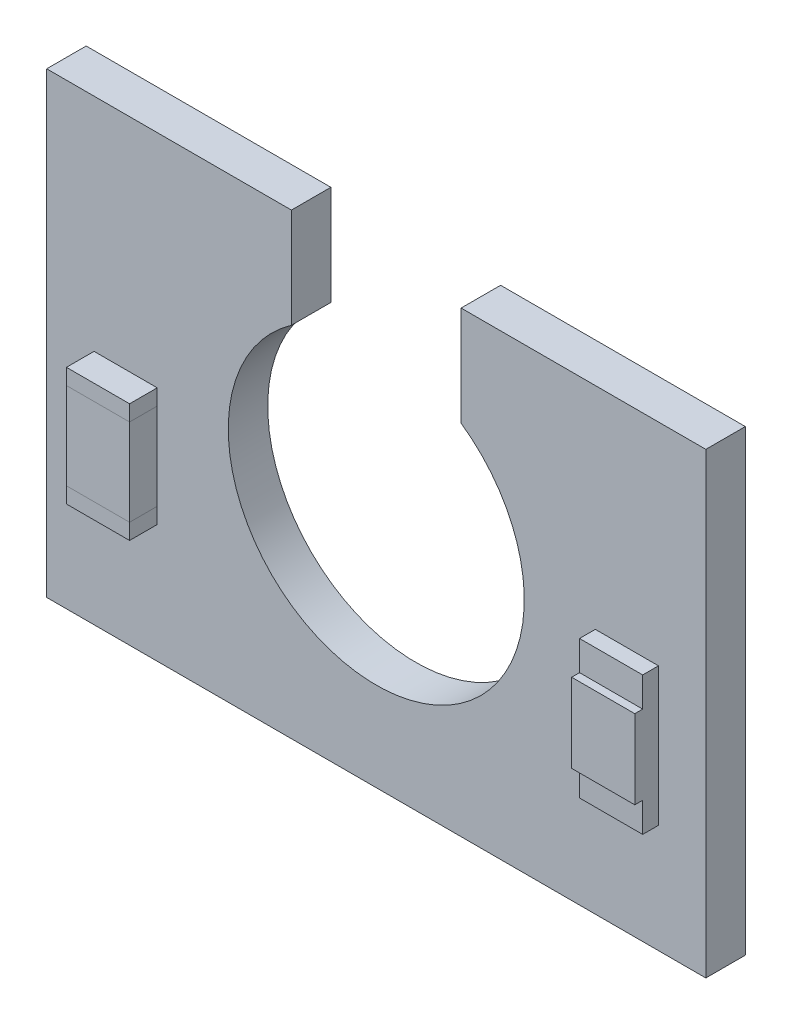
ISO-10303-21;
HEADER;
FILE_DESCRIPTION(('STEP AP214'),'2;1');
FILE_NAME('part.step','',(''),(''),'','','');
FILE_SCHEMA(('AUTOMOTIVE_DESIGN { 1 0 10303 214 1 1 1 1 }'));
ENDSEC;
DATA;
#1=APPLICATION_CONTEXT('core data for automotive mechanical design processes');
#2=APPLICATION_PROTOCOL_DEFINITION('international standard','automotive_design',2000,#1);
#3=PRODUCT_CONTEXT('',#1,'mechanical');
#4=PRODUCT('Part','Part','',(#3));
#5=PRODUCT_RELATED_PRODUCT_CATEGORY('part','',(#4));
#6=PRODUCT_DEFINITION_FORMATION('','',#4);
#7=PRODUCT_DEFINITION_CONTEXT('part definition',#1,'design');
#8=PRODUCT_DEFINITION('design','',#6,#7);
#9=PRODUCT_DEFINITION_SHAPE('','',#8);
#10=(LENGTH_UNIT() NAMED_UNIT(*) SI_UNIT(.MILLI.,.METRE.));
#11=(NAMED_UNIT(*) PLANE_ANGLE_UNIT() SI_UNIT($,.RADIAN.));
#12=(NAMED_UNIT(*) SI_UNIT($,.STERADIAN.) SOLID_ANGLE_UNIT());
#13=UNCERTAINTY_MEASURE_WITH_UNIT(LENGTH_MEASURE(1.E-05),#10,'distance_accuracy_value','');
#14=(GEOMETRIC_REPRESENTATION_CONTEXT(3) GLOBAL_UNCERTAINTY_ASSIGNED_CONTEXT((#13)) GLOBAL_UNIT_ASSIGNED_CONTEXT((#10,
#11,#12)) REPRESENTATION_CONTEXT('',''));
#15=CARTESIAN_POINT('',(0.,0.,0.));
#16=DIRECTION('',(0.,0.,1.));
#17=DIRECTION('',(1.,0.,0.));
#18=AXIS2_PLACEMENT_3D('',#15,#16,#17);
#19=CARTESIAN_POINT('',(0.,0.,0.4));
#20=DIRECTION('',(0.,0.,1.));
#21=DIRECTION('',(1.,0.,0.));
#22=AXIS2_PLACEMENT_3D('',#19,#20,#21);
#23=PLANE('',#22);
#24=DIRECTION('',(1.,0.,0.));
#25=VECTOR('',#24,1.);
#26=CARTESIAN_POINT('',(5.55,-2.3,0.4));
#27=LINE('',#26,#25);
#28=CARTESIAN_POINT('',(5.55,-2.3,0.4));
#29=VERTEX_POINT('',#28);
#30=CARTESIAN_POINT('',(7.15,-2.3,0.4));
#31=VERTEX_POINT('',#30);
#32=EDGE_CURVE('E58',#29,#31,#27,.T.);
#33=ORIENTED_EDGE('',*,*,#32,.F.);
#34=DIRECTION('',(0.,-1.,0.));
#35=VECTOR('',#34,1.);
#36=CARTESIAN_POINT('',(5.55,0.450000000000003,0.4));
#37=LINE('',#36,#35);
#38=CARTESIAN_POINT('',(5.55,-3.05,0.4));
#39=VERTEX_POINT('',#38);
#40=EDGE_CURVE('E143',#29,#39,#37,.T.);
#41=ORIENTED_EDGE('',*,*,#40,.T.);
#42=DIRECTION('',(1.,0.,0.));
#43=VECTOR('',#42,1.);
#44=CARTESIAN_POINT('',(5.55,-3.05,0.4));
#45=LINE('',#44,#43);
#46=CARTESIAN_POINT('',(7.15,-3.05,0.4));
#47=VERTEX_POINT('',#46);
#48=EDGE_CURVE('E146',#39,#47,#45,.T.);
#49=ORIENTED_EDGE('',*,*,#48,.T.);
#50=DIRECTION('',(0.,1.,0.));
#51=VECTOR('',#50,1.);
#52=CARTESIAN_POINT('',(7.15,0.450000000000003,0.4));
#53=LINE('',#52,#51);
#54=EDGE_CURVE('E139',#47,#31,#53,.T.);
#55=ORIENTED_EDGE('',*,*,#54,.T.);
#56=EDGE_LOOP('',(#33,#41,#49,#55));
#57=FACE_BOUND('',#56,.T.);
#58=ADVANCED_FACE('F43',(#57),#23,.T.);
#59=CARTESIAN_POINT('',(7.15,0.450000000000003,0.4));
#60=DIRECTION('',(-1.,0.,0.));
#61=DIRECTION('',(0.,0.,1.));
#62=AXIS2_PLACEMENT_3D('',#59,#60,#61);
#63=PLANE('',#62);
#64=DIRECTION('',(0.,1.,0.));
#65=VECTOR('',#64,1.);
#66=CARTESIAN_POINT('',(7.15,0.450000000000003,0.));
#67=LINE('',#66,#65);
#68=CARTESIAN_POINT('',(7.15,-3.05,0.));
#69=VERTEX_POINT('',#68);
#70=CARTESIAN_POINT('',(7.15,0.450000000000003,0.));
#71=VERTEX_POINT('',#70);
#72=EDGE_CURVE('E131',#69,#71,#67,.T.);
#73=ORIENTED_EDGE('',*,*,#72,.T.);
#74=DIRECTION('',(0.,0.,-1.));
#75=VECTOR('',#74,1.);
#76=CARTESIAN_POINT('',(7.15,0.450000000000003,0.4));
#77=LINE('',#76,#75);
#78=CARTESIAN_POINT('',(7.15,0.450000000000003,0.4));
#79=VERTEX_POINT('',#78);
#80=EDGE_CURVE('E12',#79,#71,#77,.T.);
#81=ORIENTED_EDGE('',*,*,#80,.F.);
#82=CARTESIAN_POINT('',(7.15,-0.299999999999997,0.4));
#83=VERTEX_POINT('',#82);
#84=EDGE_CURVE('E130',#83,#79,#53,.T.);
#85=ORIENTED_EDGE('',*,*,#84,.F.);
#86=DIRECTION('',(0.,0.,-1.));
#87=VECTOR('',#86,1.);
#88=CARTESIAN_POINT('',(7.15,-0.299999999999997,0.6));
#89=LINE('',#88,#87);
#90=CARTESIAN_POINT('',(7.15,-0.299999999999997,0.6));
#91=VERTEX_POINT('',#90);
#92=EDGE_CURVE('E112',#91,#83,#89,.T.);
#93=ORIENTED_EDGE('',*,*,#92,.F.);
#94=DIRECTION('',(0.,1.,0.));
#95=VECTOR('',#94,1.);
#96=CARTESIAN_POINT('',(7.15,-0.299999999999997,0.6));
#97=LINE('',#96,#95);
#98=CARTESIAN_POINT('',(7.15,-2.3,0.6));
#99=VERTEX_POINT('',#98);
#100=EDGE_CURVE('E118',#99,#91,#97,.T.);
#101=ORIENTED_EDGE('',*,*,#100,.F.);
#102=DIRECTION('',(0.,0.,-1.));
#103=VECTOR('',#102,1.);
#104=CARTESIAN_POINT('',(7.15,-2.3,0.6));
#105=LINE('',#104,#103);
#106=EDGE_CURVE('E176',#99,#31,#105,.T.);
#107=ORIENTED_EDGE('',*,*,#106,.T.);
#108=ORIENTED_EDGE('',*,*,#54,.F.);
#109=DIRECTION('',(0.,0.,-1.));
#110=VECTOR('',#109,1.);
#111=CARTESIAN_POINT('',(7.15,-3.05,0.4));
#112=LINE('',#111,#110);
#113=EDGE_CURVE('E147',#47,#69,#112,.T.);
#114=ORIENTED_EDGE('',*,*,#113,.T.);
#115=EDGE_LOOP('',(#73,#81,#85,#93,#101,#107,#108,#114));
#116=FACE_BOUND('',#115,.T.);
#117=ADVANCED_FACE('F45',(#116),#63,.F.);
#118=CARTESIAN_POINT('',(5.55,0.450000000000003,0.4));
#119=DIRECTION('',(0.,-1.,0.));
#120=DIRECTION('',(0.,0.,-1.));
#121=AXIS2_PLACEMENT_3D('',#118,#119,#120);
#122=PLANE('',#121);
#123=DIRECTION('',(-1.,0.,0.));
#124=VECTOR('',#123,1.);
#125=CARTESIAN_POINT('',(5.55,0.450000000000003,0.));
#126=LINE('',#125,#124);
#127=CARTESIAN_POINT('',(5.55,0.450000000000003,0.));
#128=VERTEX_POINT('',#127);
#129=EDGE_CURVE('E133',#71,#128,#126,.T.);
#130=ORIENTED_EDGE('',*,*,#129,.T.);
#131=DIRECTION('',(0.,0.,-1.));
#132=VECTOR('',#131,1.);
#133=CARTESIAN_POINT('',(5.55,0.450000000000003,0.4));
#134=LINE('',#133,#132);
#135=CARTESIAN_POINT('',(5.55,0.450000000000003,0.4));
#136=VERTEX_POINT('',#135);
#137=EDGE_CURVE('E51',#136,#128,#134,.T.);
#138=ORIENTED_EDGE('',*,*,#137,.F.);
#139=DIRECTION('',(-1.,0.,0.));
#140=VECTOR('',#139,1.);
#141=CARTESIAN_POINT('',(5.55,0.450000000000003,0.4));
#142=LINE('',#141,#140);
#143=EDGE_CURVE('E141',#79,#136,#142,.T.);
#144=ORIENTED_EDGE('',*,*,#143,.F.);
#145=ORIENTED_EDGE('',*,*,#80,.T.);
#146=EDGE_LOOP('',(#130,#138,#144,#145));
#147=FACE_BOUND('',#146,.T.);
#148=ADVANCED_FACE('F200',(#147),#122,.F.);
#149=CARTESIAN_POINT('',(5.55,0.450000000000003,0.4));
#150=DIRECTION('',(1.,0.,0.));
#151=DIRECTION('',(0.,0.,-1.));
#152=AXIS2_PLACEMENT_3D('',#149,#150,#151);
#153=PLANE('',#152);
#154=DIRECTION('',(0.,-1.,0.));
#155=VECTOR('',#154,1.);
#156=CARTESIAN_POINT('',(5.55,0.450000000000003,0.));
#157=LINE('',#156,#155);
#158=CARTESIAN_POINT('',(5.55,-3.05,0.));
#159=VERTEX_POINT('',#158);
#160=EDGE_CURVE('E150',#128,#159,#157,.T.);
#161=ORIENTED_EDGE('',*,*,#160,.T.);
#162=DIRECTION('',(0.,0.,-1.));
#163=VECTOR('',#162,1.);
#164=CARTESIAN_POINT('',(5.55,-3.05,0.4));
#165=LINE('',#164,#163);
#166=EDGE_CURVE('E156',#39,#159,#165,.T.);
#167=ORIENTED_EDGE('',*,*,#166,.F.);
#168=ORIENTED_EDGE('',*,*,#40,.F.);
#169=DIRECTION('',(0.,0.,-1.));
#170=VECTOR('',#169,1.);
#171=CARTESIAN_POINT('',(5.55,-2.3,0.6));
#172=LINE('',#171,#170);
#173=CARTESIAN_POINT('',(5.55,-2.3,0.6));
#174=VERTEX_POINT('',#173);
#175=EDGE_CURVE('E135',#174,#29,#172,.T.);
#176=ORIENTED_EDGE('',*,*,#175,.F.);
#177=DIRECTION('',(0.,-1.,0.));
#178=VECTOR('',#177,1.);
#179=CARTESIAN_POINT('',(5.55,-0.299999999999997,0.6));
#180=LINE('',#179,#178);
#181=CARTESIAN_POINT('',(5.55,-0.299999999999997,0.6));
#182=VERTEX_POINT('',#181);
#183=EDGE_CURVE('E117',#182,#174,#180,.T.);
#184=ORIENTED_EDGE('',*,*,#183,.F.);
#185=DIRECTION('',(0.,0.,-1.));
#186=VECTOR('',#185,1.);
#187=CARTESIAN_POINT('',(5.55,-0.299999999999997,0.6));
#188=LINE('',#187,#186);
#189=CARTESIAN_POINT('',(5.55,-0.299999999999997,0.4));
#190=VERTEX_POINT('',#189);
#191=EDGE_CURVE('E114',#182,#190,#188,.T.);
#192=ORIENTED_EDGE('',*,*,#191,.T.);
#193=EDGE_CURVE('E144',#136,#190,#37,.T.);
#194=ORIENTED_EDGE('',*,*,#193,.F.);
#195=ORIENTED_EDGE('',*,*,#137,.T.);
#196=EDGE_LOOP('',(#161,#167,#168,#176,#184,#192,#194,#195));
#197=FACE_BOUND('',#196,.T.);
#198=ADVANCED_FACE('F163',(#197),#153,.F.);
#199=CARTESIAN_POINT('',(5.55,-3.05,0.4));
#200=DIRECTION('',(0.,1.,0.));
#201=DIRECTION('',(0.,0.,1.));
#202=AXIS2_PLACEMENT_3D('',#199,#200,#201);
#203=PLANE('',#202);
#204=DIRECTION('',(1.,0.,0.));
#205=VECTOR('',#204,1.);
#206=CARTESIAN_POINT('',(5.55,-3.05,0.));
#207=LINE('',#206,#205);
#208=EDGE_CURVE('E152',#159,#69,#207,.T.);
#209=ORIENTED_EDGE('',*,*,#208,.T.);
#210=ORIENTED_EDGE('',*,*,#113,.F.);
#211=ORIENTED_EDGE('',*,*,#48,.F.);
#212=ORIENTED_EDGE('',*,*,#166,.T.);
#213=EDGE_LOOP('',(#209,#210,#211,#212));
#214=FACE_BOUND('',#213,.T.);
#215=ADVANCED_FACE('F173',(#214),#203,.F.);
#216=DIRECTION('',(-1.,0.,0.));
#217=VECTOR('',#216,1.);
#218=CARTESIAN_POINT('',(5.55,-0.299999999999997,0.4));
#219=LINE('',#218,#217);
#220=EDGE_CURVE('E66',#83,#190,#219,.T.);
#221=ORIENTED_EDGE('',*,*,#220,.F.);
#222=ORIENTED_EDGE('',*,*,#84,.T.);
#223=ORIENTED_EDGE('',*,*,#143,.T.);
#224=ORIENTED_EDGE('',*,*,#193,.T.);
#225=EDGE_LOOP('',(#221,#222,#223,#224));
#226=FACE_BOUND('',#225,.T.);
#227=ADVANCED_FACE('F196',(#226),#23,.T.);
#228=CARTESIAN_POINT('',(0.,0.,0.));
#229=DIRECTION('',(0.,0.,1.));
#230=DIRECTION('',(1.,0.,0.));
#231=AXIS2_PLACEMENT_3D('',#228,#229,#230);
#232=PLANE('',#231);
#233=ORIENTED_EDGE('',*,*,#72,.F.);
#234=ORIENTED_EDGE('',*,*,#208,.F.);
#235=ORIENTED_EDGE('',*,*,#160,.F.);
#236=ORIENTED_EDGE('',*,*,#129,.F.);
#237=EDGE_LOOP('',(#233,#234,#235,#236));
#238=FACE_BOUND('',#237,.T.);
#239=ADVANCED_FACE('F170',(#238),#232,.F.);
#240=CARTESIAN_POINT('',(5.55,-0.299999999999997,0.6));
#241=DIRECTION('',(0.,-1.,0.));
#242=DIRECTION('',(0.,0.,-1.));
#243=AXIS2_PLACEMENT_3D('',#240,#241,#242);
#244=PLANE('',#243);
#245=ORIENTED_EDGE('',*,*,#220,.T.);
#246=ORIENTED_EDGE('',*,*,#191,.F.);
#247=DIRECTION('',(-1.,0.,0.));
#248=VECTOR('',#247,1.);
#249=CARTESIAN_POINT('',(5.55,-0.299999999999997,0.6));
#250=LINE('',#249,#248);
#251=EDGE_CURVE('E108',#91,#182,#250,.T.);
#252=ORIENTED_EDGE('',*,*,#251,.F.);
#253=ORIENTED_EDGE('',*,*,#92,.T.);
#254=EDGE_LOOP('',(#245,#246,#252,#253));
#255=FACE_BOUND('',#254,.T.);
#256=ADVANCED_FACE('F110',(#255),#244,.F.);
#257=CARTESIAN_POINT('',(5.55,-2.3,0.6));
#258=DIRECTION('',(0.,1.,0.));
#259=DIRECTION('',(0.,0.,1.));
#260=AXIS2_PLACEMENT_3D('',#257,#258,#259);
#261=PLANE('',#260);
#262=ORIENTED_EDGE('',*,*,#32,.T.);
#263=ORIENTED_EDGE('',*,*,#106,.F.);
#264=DIRECTION('',(1.,0.,0.));
#265=VECTOR('',#264,1.);
#266=CARTESIAN_POINT('',(5.55,-2.3,0.6));
#267=LINE('',#266,#265);
#268=EDGE_CURVE('E123',#174,#99,#267,.T.);
#269=ORIENTED_EDGE('',*,*,#268,.F.);
#270=ORIENTED_EDGE('',*,*,#175,.T.);
#271=EDGE_LOOP('',(#262,#263,#269,#270));
#272=FACE_BOUND('',#271,.T.);
#273=ADVANCED_FACE('F179',(#272),#261,.F.);
#274=CARTESIAN_POINT('',(0.,0.,0.6));
#275=DIRECTION('',(0.,0.,1.));
#276=DIRECTION('',(1.,0.,0.));
#277=AXIS2_PLACEMENT_3D('',#274,#275,#276);
#278=PLANE('',#277);
#279=ORIENTED_EDGE('',*,*,#100,.T.);
#280=ORIENTED_EDGE('',*,*,#251,.T.);
#281=ORIENTED_EDGE('',*,*,#183,.T.);
#282=ORIENTED_EDGE('',*,*,#268,.T.);
#283=EDGE_LOOP('',(#279,#280,#281,#282));
#284=FACE_BOUND('',#283,.T.);
#285=ADVANCED_FACE('F121',(#284),#278,.T.);
#286=CLOSED_SHELL('',(#58,#117,#148,#198,#215,#227,#239,#256,#273,#285));
#287=MANIFOLD_SOLID_BREP('B2',#286);
#288=CARTESIAN_POINT('',(-5.55,0.200000000000001,0.7));
#289=DIRECTION('',(-1.,0.,0.));
#290=DIRECTION('',(0.,0.,1.));
#291=AXIS2_PLACEMENT_3D('',#288,#289,#290);
#292=PLANE('',#291);
#293=DIRECTION('',(0.,0.,-1.));
#294=VECTOR('',#293,1.);
#295=CARTESIAN_POINT('',(-5.55,-0.199999999999999,0.7));
#296=LINE('',#295,#294);
#297=CARTESIAN_POINT('',(-5.55,-0.199999999999999,0.7));
#298=VERTEX_POINT('',#297);
#299=CARTESIAN_POINT('',(-5.55,-0.199999999999999,0.));
#300=VERTEX_POINT('',#299);
#301=EDGE_CURVE('E346',#298,#300,#296,.T.);
#302=ORIENTED_EDGE('',*,*,#301,.T.);
#303=DIRECTION('',(0.,-1.,0.));
#304=VECTOR('',#303,1.);
#305=CARTESIAN_POINT('',(-5.55,0.200000000000001,0.));
#306=LINE('',#305,#304);
#307=CARTESIAN_POINT('',(-5.55,0.200000000000001,0.));
#308=VERTEX_POINT('',#307);
#309=EDGE_CURVE('E41',#308,#300,#306,.T.);
#310=ORIENTED_EDGE('',*,*,#309,.F.);
#311=DIRECTION('',(0.,0.,-1.));
#312=VECTOR('',#311,1.);
#313=CARTESIAN_POINT('',(-5.55,0.200000000000001,0.7));
#314=LINE('',#313,#312);
#315=CARTESIAN_POINT('',(-5.55,0.200000000000001,0.7));
#316=VERTEX_POINT('',#315);
#317=EDGE_CURVE('E334',#316,#308,#314,.T.);
#318=ORIENTED_EDGE('',*,*,#317,.F.);
#319=DIRECTION('',(0.,-1.,0.));
#320=VECTOR('',#319,1.);
#321=CARTESIAN_POINT('',(-5.55,0.200000000000001,0.7));
#322=LINE('',#321,#320);
#323=EDGE_CURVE('E342',#316,#298,#322,.T.);
#324=ORIENTED_EDGE('',*,*,#323,.T.);
#325=EDGE_LOOP('',(#302,#310,#318,#324));
#326=FACE_BOUND('',#325,.T.);
#327=ADVANCED_FACE('F283',(#326),#292,.F.);
#328=CARTESIAN_POINT('',(-5.55,0.200000000000001,0.));
#329=DIRECTION('',(0.,0.,1.));
#330=DIRECTION('',(1.,0.,0.));
#331=AXIS2_PLACEMENT_3D('',#328,#329,#330);
#332=PLANE('',#331);
#333=DIRECTION('',(-1.,0.,0.));
#334=VECTOR('',#333,1.);
#335=CARTESIAN_POINT('',(-5.55,-0.199999999999999,0.));
#336=LINE('',#335,#334);
#337=CARTESIAN_POINT('',(-7.15,-0.199999999999999,0.));
#338=VERTEX_POINT('',#337);
#339=EDGE_CURVE('E338',#300,#338,#336,.T.);
#340=ORIENTED_EDGE('',*,*,#339,.T.);
#341=DIRECTION('',(0.,-1.,0.));
#342=VECTOR('',#341,1.);
#343=CARTESIAN_POINT('',(-7.15,0.200000000000001,0.));
#344=LINE('',#343,#342);
#345=CARTESIAN_POINT('',(-7.15,0.200000000000001,0.));
#346=VERTEX_POINT('',#345);
#347=EDGE_CURVE('E291',#346,#338,#344,.T.);
#348=ORIENTED_EDGE('',*,*,#347,.F.);
#349=DIRECTION('',(-1.,0.,0.));
#350=VECTOR('',#349,1.);
#351=CARTESIAN_POINT('',(-5.55,0.200000000000001,0.));
#352=LINE('',#351,#350);
#353=EDGE_CURVE('E329',#308,#346,#352,.T.);
#354=ORIENTED_EDGE('',*,*,#353,.F.);
#355=ORIENTED_EDGE('',*,*,#309,.T.);
#356=EDGE_LOOP('',(#340,#348,#354,#355));
#357=FACE_BOUND('',#356,.T.);
#358=ADVANCED_FACE('F337',(#357),#332,.F.);
#359=CARTESIAN_POINT('',(-7.15,0.200000000000001,0.));
#360=DIRECTION('',(1.,0.,0.));
#361=DIRECTION('',(0.,0.,-1.));
#362=AXIS2_PLACEMENT_3D('',#359,#360,#361);
#363=PLANE('',#362);
#364=DIRECTION('',(0.,0.,1.));
#365=VECTOR('',#364,1.);
#366=CARTESIAN_POINT('',(-7.15,-0.199999999999999,0.));
#367=LINE('',#366,#365);
#368=CARTESIAN_POINT('',(-7.15,-0.199999999999999,0.7));
#369=VERTEX_POINT('',#368);
#370=EDGE_CURVE('E316',#338,#369,#367,.T.);
#371=ORIENTED_EDGE('',*,*,#370,.T.);
#372=DIRECTION('',(0.,-1.,0.));
#373=VECTOR('',#372,1.);
#374=CARTESIAN_POINT('',(-7.15,0.200000000000001,0.7));
#375=LINE('',#374,#373);
#376=CARTESIAN_POINT('',(-7.15,0.200000000000001,0.7));
#377=VERTEX_POINT('',#376);
#378=EDGE_CURVE('E339',#377,#369,#375,.T.);
#379=ORIENTED_EDGE('',*,*,#378,.F.);
#380=DIRECTION('',(0.,0.,1.));
#381=VECTOR('',#380,1.);
#382=CARTESIAN_POINT('',(-7.15,0.200000000000001,0.));
#383=LINE('',#382,#381);
#384=EDGE_CURVE('E332',#346,#377,#383,.T.);
#385=ORIENTED_EDGE('',*,*,#384,.F.);
#386=ORIENTED_EDGE('',*,*,#347,.T.);
#387=EDGE_LOOP('',(#371,#379,#385,#386));
#388=FACE_BOUND('',#387,.T.);
#389=ADVANCED_FACE('F340',(#388),#363,.F.);
#390=CARTESIAN_POINT('',(-7.15,0.200000000000001,0.7));
#391=DIRECTION('',(0.,0.,-1.));
#392=DIRECTION('',(-1.,0.,0.));
#393=AXIS2_PLACEMENT_3D('',#390,#391,#392);
#394=PLANE('',#393);
#395=DIRECTION('',(1.,0.,0.));
#396=VECTOR('',#395,1.);
#397=CARTESIAN_POINT('',(-7.15,-0.199999999999999,0.7));
#398=LINE('',#397,#396);
#399=EDGE_CURVE('E322',#369,#298,#398,.T.);
#400=ORIENTED_EDGE('',*,*,#399,.T.);
#401=ORIENTED_EDGE('',*,*,#323,.F.);
#402=DIRECTION('',(1.,0.,0.));
#403=VECTOR('',#402,1.);
#404=CARTESIAN_POINT('',(-7.15,0.200000000000001,0.7));
#405=LINE('',#404,#403);
#406=EDGE_CURVE('E299',#377,#316,#405,.T.);
#407=ORIENTED_EDGE('',*,*,#406,.F.);
#408=ORIENTED_EDGE('',*,*,#378,.T.);
#409=EDGE_LOOP('',(#400,#401,#407,#408));
#410=FACE_BOUND('',#409,.T.);
#411=ADVANCED_FACE('F353',(#410),#394,.F.);
#412=CARTESIAN_POINT('',(0.,0.200000000000001,0.));
#413=DIRECTION('',(0.,1.,0.));
#414=DIRECTION('',(0.,0.,1.));
#415=AXIS2_PLACEMENT_3D('',#412,#413,#414);
#416=PLANE('',#415);
#417=ORIENTED_EDGE('',*,*,#317,.T.);
#418=ORIENTED_EDGE('',*,*,#353,.T.);
#419=ORIENTED_EDGE('',*,*,#384,.T.);
#420=ORIENTED_EDGE('',*,*,#406,.T.);
#421=EDGE_LOOP('',(#417,#418,#419,#420));
#422=FACE_BOUND('',#421,.T.);
#423=ADVANCED_FACE('F330',(#422),#416,.T.);
#424=CARTESIAN_POINT('',(0.,-0.199999999999999,0.));
#425=DIRECTION('',(0.,1.,0.));
#426=DIRECTION('',(0.,0.,1.));
#427=AXIS2_PLACEMENT_3D('',#424,#425,#426);
#428=PLANE('',#427);
#429=ORIENTED_EDGE('',*,*,#301,.F.);
#430=ORIENTED_EDGE('',*,*,#399,.F.);
#431=ORIENTED_EDGE('',*,*,#370,.F.);
#432=ORIENTED_EDGE('',*,*,#339,.F.);
#433=EDGE_LOOP('',(#429,#430,#431,#432));
#434=FACE_BOUND('',#433,.T.);
#435=ADVANCED_FACE('F356',(#434),#428,.F.);
#436=CLOSED_SHELL('',(#327,#358,#389,#411,#423,#435));
#437=MANIFOLD_SOLID_BREP('B6',#436);
#438=CARTESIAN_POINT('',(-7.15,-2.8,0.7));
#439=DIRECTION('',(1.,0.,0.));
#440=DIRECTION('',(0.,0.,-1.));
#441=AXIS2_PLACEMENT_3D('',#438,#439,#440);
#442=PLANE('',#441);
#443=DIRECTION('',(0.,0.,-1.));
#444=VECTOR('',#443,1.);
#445=CARTESIAN_POINT('',(-7.15,-2.4,0.7));
#446=LINE('',#445,#444);
#447=CARTESIAN_POINT('',(-7.15,-2.4,0.7));
#448=VERTEX_POINT('',#447);
#449=CARTESIAN_POINT('',(-7.15,-2.4,0.));
#450=VERTEX_POINT('',#449);
#451=EDGE_CURVE('E479',#448,#450,#446,.T.);
#452=ORIENTED_EDGE('',*,*,#451,.T.);
#453=DIRECTION('',(0.,1.,0.));
#454=VECTOR('',#453,1.);
#455=CARTESIAN_POINT('',(-7.15,-2.8,0.));
#456=LINE('',#455,#454);
#457=CARTESIAN_POINT('',(-7.15,-2.8,0.));
#458=VERTEX_POINT('',#457);
#459=EDGE_CURVE('E281',#458,#450,#456,.T.);
#460=ORIENTED_EDGE('',*,*,#459,.F.);
#461=DIRECTION('',(0.,0.,-1.));
#462=VECTOR('',#461,1.);
#463=CARTESIAN_POINT('',(-7.15,-2.8,0.7));
#464=LINE('',#463,#462);
#465=CARTESIAN_POINT('',(-7.15,-2.8,0.7));
#466=VERTEX_POINT('',#465);
#467=EDGE_CURVE('E467',#466,#458,#464,.T.);
#468=ORIENTED_EDGE('',*,*,#467,.F.);
#469=DIRECTION('',(0.,1.,0.));
#470=VECTOR('',#469,1.);
#471=CARTESIAN_POINT('',(-7.15,-2.8,0.7));
#472=LINE('',#471,#470);
#473=EDGE_CURVE('E475',#466,#448,#472,.T.);
#474=ORIENTED_EDGE('',*,*,#473,.T.);
#475=EDGE_LOOP('',(#452,#460,#468,#474));
#476=FACE_BOUND('',#475,.T.);
#477=ADVANCED_FACE('F416',(#476),#442,.F.);
#478=CARTESIAN_POINT('',(-7.15,-2.8,0.));
#479=DIRECTION('',(0.,0.,1.));
#480=DIRECTION('',(1.,0.,0.));
#481=AXIS2_PLACEMENT_3D('',#478,#479,#480);
#482=PLANE('',#481);
#483=DIRECTION('',(1.,0.,0.));
#484=VECTOR('',#483,1.);
#485=CARTESIAN_POINT('',(-7.15,-2.4,0.));
#486=LINE('',#485,#484);
#487=CARTESIAN_POINT('',(-5.55,-2.4,0.));
#488=VERTEX_POINT('',#487);
#489=EDGE_CURVE('E471',#450,#488,#486,.T.);
#490=ORIENTED_EDGE('',*,*,#489,.T.);
#491=DIRECTION('',(0.,1.,0.));
#492=VECTOR('',#491,1.);
#493=CARTESIAN_POINT('',(-5.55,-2.8,0.));
#494=LINE('',#493,#492);
#495=CARTESIAN_POINT('',(-5.55,-2.8,0.));
#496=VERTEX_POINT('',#495);
#497=EDGE_CURVE('E424',#496,#488,#494,.T.);
#498=ORIENTED_EDGE('',*,*,#497,.F.);
#499=DIRECTION('',(1.,0.,0.));
#500=VECTOR('',#499,1.);
#501=CARTESIAN_POINT('',(-7.15,-2.8,0.));
#502=LINE('',#501,#500);
#503=EDGE_CURVE('E462',#458,#496,#502,.T.);
#504=ORIENTED_EDGE('',*,*,#503,.F.);
#505=ORIENTED_EDGE('',*,*,#459,.T.);
#506=EDGE_LOOP('',(#490,#498,#504,#505));
#507=FACE_BOUND('',#506,.T.);
#508=ADVANCED_FACE('F470',(#507),#482,.F.);
#509=CARTESIAN_POINT('',(-5.55,-2.8,0.));
#510=DIRECTION('',(-1.,0.,0.));
#511=DIRECTION('',(0.,0.,1.));
#512=AXIS2_PLACEMENT_3D('',#509,#510,#511);
#513=PLANE('',#512);
#514=DIRECTION('',(0.,0.,1.));
#515=VECTOR('',#514,1.);
#516=CARTESIAN_POINT('',(-5.55,-2.4,0.));
#517=LINE('',#516,#515);
#518=CARTESIAN_POINT('',(-5.55,-2.4,0.7));
#519=VERTEX_POINT('',#518);
#520=EDGE_CURVE('E449',#488,#519,#517,.T.);
#521=ORIENTED_EDGE('',*,*,#520,.T.);
#522=DIRECTION('',(0.,1.,0.));
#523=VECTOR('',#522,1.);
#524=CARTESIAN_POINT('',(-5.55,-2.8,0.7));
#525=LINE('',#524,#523);
#526=CARTESIAN_POINT('',(-5.55,-2.8,0.7));
#527=VERTEX_POINT('',#526);
#528=EDGE_CURVE('E472',#527,#519,#525,.T.);
#529=ORIENTED_EDGE('',*,*,#528,.F.);
#530=DIRECTION('',(0.,0.,1.));
#531=VECTOR('',#530,1.);
#532=CARTESIAN_POINT('',(-5.55,-2.8,0.));
#533=LINE('',#532,#531);
#534=EDGE_CURVE('E465',#496,#527,#533,.T.);
#535=ORIENTED_EDGE('',*,*,#534,.F.);
#536=ORIENTED_EDGE('',*,*,#497,.T.);
#537=EDGE_LOOP('',(#521,#529,#535,#536));
#538=FACE_BOUND('',#537,.T.);
#539=ADVANCED_FACE('F473',(#538),#513,.F.);
#540=CARTESIAN_POINT('',(-5.55,-2.8,0.7));
#541=DIRECTION('',(0.,0.,-1.));
#542=DIRECTION('',(-1.,0.,0.));
#543=AXIS2_PLACEMENT_3D('',#540,#541,#542);
#544=PLANE('',#543);
#545=DIRECTION('',(-1.,0.,0.));
#546=VECTOR('',#545,1.);
#547=CARTESIAN_POINT('',(-5.55,-2.4,0.7));
#548=LINE('',#547,#546);
#549=EDGE_CURVE('E455',#519,#448,#548,.T.);
#550=ORIENTED_EDGE('',*,*,#549,.T.);
#551=ORIENTED_EDGE('',*,*,#473,.F.);
#552=DIRECTION('',(-1.,0.,0.));
#553=VECTOR('',#552,1.);
#554=CARTESIAN_POINT('',(-5.55,-2.8,0.7));
#555=LINE('',#554,#553);
#556=EDGE_CURVE('E432',#527,#466,#555,.T.);
#557=ORIENTED_EDGE('',*,*,#556,.F.);
#558=ORIENTED_EDGE('',*,*,#528,.T.);
#559=EDGE_LOOP('',(#550,#551,#557,#558));
#560=FACE_BOUND('',#559,.T.);
#561=ADVANCED_FACE('F486',(#560),#544,.F.);
#562=CARTESIAN_POINT('',(0.,-2.8,0.));
#563=DIRECTION('',(0.,-1.,0.));
#564=DIRECTION('',(0.,0.,-1.));
#565=AXIS2_PLACEMENT_3D('',#562,#563,#564);
#566=PLANE('',#565);
#567=ORIENTED_EDGE('',*,*,#467,.T.);
#568=ORIENTED_EDGE('',*,*,#503,.T.);
#569=ORIENTED_EDGE('',*,*,#534,.T.);
#570=ORIENTED_EDGE('',*,*,#556,.T.);
#571=EDGE_LOOP('',(#567,#568,#569,#570));
#572=FACE_BOUND('',#571,.T.);
#573=ADVANCED_FACE('F463',(#572),#566,.T.);
#574=CARTESIAN_POINT('',(0.,-2.4,0.));
#575=DIRECTION('',(0.,-1.,0.));
#576=DIRECTION('',(0.,0.,-1.));
#577=AXIS2_PLACEMENT_3D('',#574,#575,#576);
#578=PLANE('',#577);
#579=ORIENTED_EDGE('',*,*,#451,.F.);
#580=ORIENTED_EDGE('',*,*,#549,.F.);
#581=ORIENTED_EDGE('',*,*,#520,.F.);
#582=ORIENTED_EDGE('',*,*,#489,.F.);
#583=EDGE_LOOP('',(#579,#580,#581,#582));
#584=FACE_BOUND('',#583,.T.);
#585=ADVANCED_FACE('F489',(#584),#578,.F.);
#586=CLOSED_SHELL('',(#477,#508,#539,#561,#573,#585));
#587=MANIFOLD_SOLID_BREP('B35',#586);
#588=CARTESIAN_POINT('',(-5.55,-0.199999999999999,0.7));
#589=DIRECTION('',(-1.,0.,0.));
#590=DIRECTION('',(0.,0.,1.));
#591=AXIS2_PLACEMENT_3D('',#588,#589,#590);
#592=PLANE('',#591);
#593=DIRECTION('',(0.,1.,0.));
#594=VECTOR('',#593,1.);
#595=CARTESIAN_POINT('',(-5.55,-0.199999999999999,0.));
#596=LINE('',#595,#594);
#597=CARTESIAN_POINT('',(-5.55,-2.4,0.));
#598=VERTEX_POINT('',#597);
#599=CARTESIAN_POINT('',(-5.55,-0.199999999999999,0.));
#600=VERTEX_POINT('',#599);
#601=EDGE_CURVE('E611',#598,#600,#596,.T.);
#602=ORIENTED_EDGE('',*,*,#601,.T.);
#603=DIRECTION('',(0.,0.,-1.));
#604=VECTOR('',#603,1.);
#605=CARTESIAN_POINT('',(-5.55,-0.199999999999999,0.7));
#606=LINE('',#605,#604);
#607=CARTESIAN_POINT('',(-5.55,-0.199999999999999,0.7));
#608=VERTEX_POINT('',#607);
#609=EDGE_CURVE('E414',#608,#600,#606,.T.);
#610=ORIENTED_EDGE('',*,*,#609,.F.);
#611=DIRECTION('',(0.,1.,0.));
#612=VECTOR('',#611,1.);
#613=CARTESIAN_POINT('',(-5.55,-0.199999999999999,0.7));
#614=LINE('',#613,#612);
#615=CARTESIAN_POINT('',(-5.55,-2.4,0.7));
#616=VERTEX_POINT('',#615);
#617=EDGE_CURVE('E599',#616,#608,#614,.T.);
#618=ORIENTED_EDGE('',*,*,#617,.F.);
#619=DIRECTION('',(0.,0.,-1.));
#620=VECTOR('',#619,1.);
#621=CARTESIAN_POINT('',(-5.55,-2.4,0.7));
#622=LINE('',#621,#620);
#623=EDGE_CURVE('E607',#616,#598,#622,.T.);
#624=ORIENTED_EDGE('',*,*,#623,.T.);
#625=EDGE_LOOP('',(#602,#610,#618,#624));
#626=FACE_BOUND('',#625,.T.);
#627=ADVANCED_FACE('F548',(#626),#592,.F.);
#628=CARTESIAN_POINT('',(-7.15,-0.199999999999999,0.7));
#629=DIRECTION('',(0.,-1.,0.));
#630=DIRECTION('',(0.,0.,-1.));
#631=AXIS2_PLACEMENT_3D('',#628,#629,#630);
#632=PLANE('',#631);
#633=DIRECTION('',(-1.,0.,0.));
#634=VECTOR('',#633,1.);
#635=CARTESIAN_POINT('',(-7.15,-0.199999999999999,0.));
#636=LINE('',#635,#634);
#637=CARTESIAN_POINT('',(-7.15,-0.199999999999999,0.));
#638=VERTEX_POINT('',#637);
#639=EDGE_CURVE('E603',#600,#638,#636,.T.);
#640=ORIENTED_EDGE('',*,*,#639,.T.);
#641=DIRECTION('',(0.,0.,-1.));
#642=VECTOR('',#641,1.);
#643=CARTESIAN_POINT('',(-7.15,-0.199999999999999,0.7));
#644=LINE('',#643,#642);
#645=CARTESIAN_POINT('',(-7.15,-0.199999999999999,0.7));
#646=VERTEX_POINT('',#645);
#647=EDGE_CURVE('E556',#646,#638,#644,.T.);
#648=ORIENTED_EDGE('',*,*,#647,.F.);
#649=DIRECTION('',(-1.,0.,0.));
#650=VECTOR('',#649,1.);
#651=CARTESIAN_POINT('',(-7.15,-0.199999999999999,0.7));
#652=LINE('',#651,#650);
#653=EDGE_CURVE('E594',#608,#646,#652,.T.);
#654=ORIENTED_EDGE('',*,*,#653,.F.);
#655=ORIENTED_EDGE('',*,*,#609,.T.);
#656=EDGE_LOOP('',(#640,#648,#654,#655));
#657=FACE_BOUND('',#656,.T.);
#658=ADVANCED_FACE('F602',(#657),#632,.F.);
#659=CARTESIAN_POINT('',(-7.15,-0.199999999999999,0.7));
#660=DIRECTION('',(1.,0.,0.));
#661=DIRECTION('',(0.,0.,-1.));
#662=AXIS2_PLACEMENT_3D('',#659,#660,#661);
#663=PLANE('',#662);
#664=DIRECTION('',(0.,-1.,0.));
#665=VECTOR('',#664,1.);
#666=CARTESIAN_POINT('',(-7.15,-0.199999999999999,0.));
#667=LINE('',#666,#665);
#668=CARTESIAN_POINT('',(-7.15,-2.4,0.));
#669=VERTEX_POINT('',#668);
#670=EDGE_CURVE('E581',#638,#669,#667,.T.);
#671=ORIENTED_EDGE('',*,*,#670,.T.);
#672=DIRECTION('',(0.,0.,-1.));
#673=VECTOR('',#672,1.);
#674=CARTESIAN_POINT('',(-7.15,-2.4,0.7));
#675=LINE('',#674,#673);
#676=CARTESIAN_POINT('',(-7.15,-2.4,0.7));
#677=VERTEX_POINT('',#676);
#678=EDGE_CURVE('E604',#677,#669,#675,.T.);
#679=ORIENTED_EDGE('',*,*,#678,.F.);
#680=DIRECTION('',(0.,-1.,0.));
#681=VECTOR('',#680,1.);
#682=CARTESIAN_POINT('',(-7.15,-0.199999999999999,0.7));
#683=LINE('',#682,#681);
#684=EDGE_CURVE('E597',#646,#677,#683,.T.);
#685=ORIENTED_EDGE('',*,*,#684,.F.);
#686=ORIENTED_EDGE('',*,*,#647,.T.);
#687=EDGE_LOOP('',(#671,#679,#685,#686));
#688=FACE_BOUND('',#687,.T.);
#689=ADVANCED_FACE('F605',(#688),#663,.F.);
#690=CARTESIAN_POINT('',(-7.15,-2.4,0.7));
#691=DIRECTION('',(0.,1.,0.));
#692=DIRECTION('',(0.,0.,1.));
#693=AXIS2_PLACEMENT_3D('',#690,#691,#692);
#694=PLANE('',#693);
#695=DIRECTION('',(1.,0.,0.));
#696=VECTOR('',#695,1.);
#697=CARTESIAN_POINT('',(-7.15,-2.4,0.));
#698=LINE('',#697,#696);
#699=EDGE_CURVE('E587',#669,#598,#698,.T.);
#700=ORIENTED_EDGE('',*,*,#699,.T.);
#701=ORIENTED_EDGE('',*,*,#623,.F.);
#702=DIRECTION('',(1.,0.,0.));
#703=VECTOR('',#702,1.);
#704=CARTESIAN_POINT('',(-7.15,-2.4,0.7));
#705=LINE('',#704,#703);
#706=EDGE_CURVE('E564',#677,#616,#705,.T.);
#707=ORIENTED_EDGE('',*,*,#706,.F.);
#708=ORIENTED_EDGE('',*,*,#678,.T.);
#709=EDGE_LOOP('',(#700,#701,#707,#708));
#710=FACE_BOUND('',#709,.T.);
#711=ADVANCED_FACE('F618',(#710),#694,.F.);
#712=CARTESIAN_POINT('',(0.,0.,0.7));
#713=DIRECTION('',(0.,0.,1.));
#714=DIRECTION('',(1.,0.,0.));
#715=AXIS2_PLACEMENT_3D('',#712,#713,#714);
#716=PLANE('',#715);
#717=ORIENTED_EDGE('',*,*,#617,.T.);
#718=ORIENTED_EDGE('',*,*,#653,.T.);
#719=ORIENTED_EDGE('',*,*,#684,.T.);
#720=ORIENTED_EDGE('',*,*,#706,.T.);
#721=EDGE_LOOP('',(#717,#718,#719,#720));
#722=FACE_BOUND('',#721,.T.);
#723=ADVANCED_FACE('F595',(#722),#716,.T.);
#724=CARTESIAN_POINT('',(0.,0.,0.));
#725=DIRECTION('',(0.,0.,1.));
#726=DIRECTION('',(1.,0.,0.));
#727=AXIS2_PLACEMENT_3D('',#724,#725,#726);
#728=PLANE('',#727);
#729=ORIENTED_EDGE('',*,*,#601,.F.);
#730=ORIENTED_EDGE('',*,*,#699,.F.);
#731=ORIENTED_EDGE('',*,*,#670,.F.);
#732=ORIENTED_EDGE('',*,*,#639,.F.);
#733=EDGE_LOOP('',(#729,#730,#731,#732));
#734=FACE_BOUND('',#733,.T.);
#735=ADVANCED_FACE('F621',(#734),#728,.F.);
#736=CLOSED_SHELL('',(#627,#658,#689,#711,#723,#735));
#737=MANIFOLD_SOLID_BREP('B275',#736);
#738=CARTESIAN_POINT('',(-8.35,5.8,-1.));
#739=DIRECTION('',(0.,1.,0.));
#740=DIRECTION('',(0.,0.,1.));
#741=AXIS2_PLACEMENT_3D('',#738,#739,#740);
#742=PLANE('',#741);
#743=DIRECTION('',(0.,0.,1.));
#744=VECTOR('',#743,1.);
#745=CARTESIAN_POINT('',(-2.15,5.8,-1.));
#746=LINE('',#745,#744);
#747=CARTESIAN_POINT('',(-2.15,5.8,-1.));
#748=VERTEX_POINT('',#747);
#749=CARTESIAN_POINT('',(-2.15,5.8,0.));
#750=VERTEX_POINT('',#749);
#751=EDGE_CURVE('E772',#748,#750,#746,.T.);
#752=ORIENTED_EDGE('',*,*,#751,.F.);
#753=DIRECTION('',(-1.,0.,0.));
#754=VECTOR('',#753,1.);
#755=CARTESIAN_POINT('',(-8.35,5.8,-1.));
#756=LINE('',#755,#754);
#757=CARTESIAN_POINT('',(-8.35,5.8,-1.));
#758=VERTEX_POINT('',#757);
#759=EDGE_CURVE('E763',#748,#758,#756,.T.);
#760=ORIENTED_EDGE('',*,*,#759,.T.);
#761=DIRECTION('',(0.,0.,1.));
#762=VECTOR('',#761,1.);
#763=CARTESIAN_POINT('',(-8.35,5.8,-1.));
#764=LINE('',#763,#762);
#765=CARTESIAN_POINT('',(-8.35,5.8,0.));
#766=VERTEX_POINT('',#765);
#767=EDGE_CURVE('E800',#758,#766,#764,.T.);
#768=ORIENTED_EDGE('',*,*,#767,.T.);
#769=DIRECTION('',(-1.,0.,0.));
#770=VECTOR('',#769,1.);
#771=CARTESIAN_POINT('',(-8.35,5.8,0.));
#772=LINE('',#771,#770);
#773=EDGE_CURVE('E791',#750,#766,#772,.T.);
#774=ORIENTED_EDGE('',*,*,#773,.F.);
#775=EDGE_LOOP('',(#752,#760,#768,#774));
#776=FACE_BOUND('',#775,.T.);
#777=ADVANCED_FACE('F671',(#776),#742,.T.);
#778=CARTESIAN_POINT('',(8.35,5.8,-1.));
#779=DIRECTION('',(1.,0.,0.));
#780=DIRECTION('',(0.,0.,-1.));
#781=AXIS2_PLACEMENT_3D('',#778,#779,#780);
#782=PLANE('',#781);
#783=DIRECTION('',(0.,1.,0.));
#784=VECTOR('',#783,1.);
#785=CARTESIAN_POINT('',(8.35,5.8,0.));
#786=LINE('',#785,#784);
#787=CARTESIAN_POINT('',(8.35,-5.8,0.));
#788=VERTEX_POINT('',#787);
#789=CARTESIAN_POINT('',(8.35,5.8,0.));
#790=VERTEX_POINT('',#789);
#791=EDGE_CURVE('E774',#788,#790,#786,.T.);
#792=ORIENTED_EDGE('',*,*,#791,.F.);
#793=DIRECTION('',(0.,0.,1.));
#794=VECTOR('',#793,1.);
#795=CARTESIAN_POINT('',(8.35,-5.8,-1.));
#796=LINE('',#795,#794);
#797=CARTESIAN_POINT('',(8.35,-5.8,-1.));
#798=VERTEX_POINT('',#797);
#799=EDGE_CURVE('E546',#798,#788,#796,.T.);
#800=ORIENTED_EDGE('',*,*,#799,.F.);
#801=DIRECTION('',(0.,1.,0.));
#802=VECTOR('',#801,1.);
#803=CARTESIAN_POINT('',(8.35,5.8,-1.));
#804=LINE('',#803,#802);
#805=CARTESIAN_POINT('',(8.35,5.8,-1.));
#806=VERTEX_POINT('',#805);
#807=EDGE_CURVE('E779',#798,#806,#804,.T.);
#808=ORIENTED_EDGE('',*,*,#807,.T.);
#809=DIRECTION('',(0.,0.,1.));
#810=VECTOR('',#809,1.);
#811=CARTESIAN_POINT('',(8.35,5.8,-1.));
#812=LINE('',#811,#810);
#813=EDGE_CURVE('E675',#806,#790,#812,.T.);
#814=ORIENTED_EDGE('',*,*,#813,.T.);
#815=EDGE_LOOP('',(#792,#800,#808,#814));
#816=FACE_BOUND('',#815,.T.);
#817=ADVANCED_FACE('F673',(#816),#782,.T.);
#818=CARTESIAN_POINT('',(-8.35,-5.8,-1.));
#819=DIRECTION('',(0.,-1.,0.));
#820=DIRECTION('',(0.,0.,-1.));
#821=AXIS2_PLACEMENT_3D('',#818,#819,#820);
#822=PLANE('',#821);
#823=DIRECTION('',(1.,0.,0.));
#824=VECTOR('',#823,1.);
#825=CARTESIAN_POINT('',(-8.35,-5.8,0.));
#826=LINE('',#825,#824);
#827=CARTESIAN_POINT('',(-8.35,-5.8,0.));
#828=VERTEX_POINT('',#827);
#829=EDGE_CURVE('E781',#828,#788,#826,.T.);
#830=ORIENTED_EDGE('',*,*,#829,.F.);
#831=DIRECTION('',(0.,0.,1.));
#832=VECTOR('',#831,1.);
#833=CARTESIAN_POINT('',(-8.35,-5.8,-1.));
#834=LINE('',#833,#832);
#835=CARTESIAN_POINT('',(-8.35,-5.8,-1.));
#836=VERTEX_POINT('',#835);
#837=EDGE_CURVE('E680',#836,#828,#834,.T.);
#838=ORIENTED_EDGE('',*,*,#837,.F.);
#839=DIRECTION('',(1.,0.,0.));
#840=VECTOR('',#839,1.);
#841=CARTESIAN_POINT('',(-8.35,-5.8,-1.));
#842=LINE('',#841,#840);
#843=EDGE_CURVE('E787',#836,#798,#842,.T.);
#844=ORIENTED_EDGE('',*,*,#843,.T.);
#845=ORIENTED_EDGE('',*,*,#799,.T.);
#846=EDGE_LOOP('',(#830,#838,#844,#845));
#847=FACE_BOUND('',#846,.T.);
#848=ADVANCED_FACE('F810',(#847),#822,.T.);
#849=CARTESIAN_POINT('',(-8.35,5.8,-1.));
#850=DIRECTION('',(-1.,0.,0.));
#851=DIRECTION('',(0.,-1.,0.));
#852=AXIS2_PLACEMENT_3D('',#849,#850,#851);
#853=PLANE('',#852);
#854=DIRECTION('',(0.,-1.,0.));
#855=VECTOR('',#854,1.);
#856=CARTESIAN_POINT('',(-8.35,5.8,0.));
#857=LINE('',#856,#855);
#858=EDGE_CURVE('E795',#766,#828,#857,.T.);
#859=ORIENTED_EDGE('',*,*,#858,.F.);
#860=ORIENTED_EDGE('',*,*,#767,.F.);
#861=DIRECTION('',(0.,-1.,0.));
#862=VECTOR('',#861,1.);
#863=CARTESIAN_POINT('',(-8.35,5.8,-1.));
#864=LINE('',#863,#862);
#865=EDGE_CURVE('E784',#758,#836,#864,.T.);
#866=ORIENTED_EDGE('',*,*,#865,.T.);
#867=ORIENTED_EDGE('',*,*,#837,.T.);
#868=EDGE_LOOP('',(#859,#860,#866,#867));
#869=FACE_BOUND('',#868,.T.);
#870=ADVANCED_FACE('F813',(#869),#853,.T.);
#871=DIRECTION('',(0.,0.,1.));
#872=VECTOR('',#871,1.);
#873=CARTESIAN_POINT('',(2.15,5.8,-1.));
#874=LINE('',#873,#872);
#875=CARTESIAN_POINT('',(2.15,5.8,-1.));
#876=VERTEX_POINT('',#875);
#877=CARTESIAN_POINT('',(2.15,5.8,0.));
#878=VERTEX_POINT('',#877);
#879=EDGE_CURVE('E775',#876,#878,#874,.T.);
#880=ORIENTED_EDGE('',*,*,#879,.T.);
#881=EDGE_CURVE('E792',#790,#878,#772,.T.);
#882=ORIENTED_EDGE('',*,*,#881,.F.);
#883=ORIENTED_EDGE('',*,*,#813,.F.);
#884=EDGE_CURVE('E782',#806,#876,#756,.T.);
#885=ORIENTED_EDGE('',*,*,#884,.T.);
#886=EDGE_LOOP('',(#880,#882,#883,#885));
#887=FACE_BOUND('',#886,.T.);
#888=ADVANCED_FACE('F806',(#887),#742,.T.);
#889=CARTESIAN_POINT('',(0.,0.,-1.));
#890=DIRECTION('',(0.,0.,1.));
#891=DIRECTION('',(1.,0.,0.));
#892=AXIS2_PLACEMENT_3D('',#889,#890,#891);
#893=PLANE('',#892);
#894=ORIENTED_EDGE('',*,*,#759,.F.);
#895=DIRECTION('',(0.,-1.,0.));
#896=VECTOR('',#895,1.);
#897=CARTESIAN_POINT('',(-2.15,5.8,-1.));
#898=LINE('',#897,#896);
#899=CARTESIAN_POINT('',(-2.15,3.27245829914745,-1.));
#900=VERTEX_POINT('',#899);
#901=EDGE_CURVE('E745',#748,#900,#898,.T.);
#902=ORIENTED_EDGE('',*,*,#901,.T.);
#903=CARTESIAN_POINT('',(0.,0.200000000000002,-1.));
#904=DIRECTION('',(0.,0.,1.));
#905=DIRECTION('',(1.,0.,0.));
#906=AXIS2_PLACEMENT_3D('',#903,#904,#905);
#907=CIRCLE('',#906,3.75);
#908=CARTESIAN_POINT('',(2.15,3.27245829914744,-1.));
#909=VERTEX_POINT('',#908);
#910=EDGE_CURVE('E754',#900,#909,#907,.T.);
#911=ORIENTED_EDGE('',*,*,#910,.T.);
#912=DIRECTION('',(0.,1.,0.));
#913=VECTOR('',#912,1.);
#914=CARTESIAN_POINT('',(2.15,5.8,-1.));
#915=LINE('',#914,#913);
#916=EDGE_CURVE('E751',#909,#876,#915,.T.);
#917=ORIENTED_EDGE('',*,*,#916,.T.);
#918=ORIENTED_EDGE('',*,*,#884,.F.);
#919=ORIENTED_EDGE('',*,*,#807,.F.);
#920=ORIENTED_EDGE('',*,*,#843,.F.);
#921=ORIENTED_EDGE('',*,*,#865,.F.);
#922=EDGE_LOOP('',(#894,#902,#911,#917,#918,#919,#920,#921));
#923=FACE_BOUND('',#922,.T.);
#924=ADVANCED_FACE('F761',(#923),#893,.F.);
#925=CARTESIAN_POINT('',(0.,0.,0.));
#926=DIRECTION('',(0.,0.,1.));
#927=DIRECTION('',(1.,0.,0.));
#928=AXIS2_PLACEMENT_3D('',#925,#926,#927);
#929=PLANE('',#928);
#930=DIRECTION('',(0.,-1.,0.));
#931=VECTOR('',#930,1.);
#932=CARTESIAN_POINT('',(-2.15,5.8,0.));
#933=LINE('',#932,#931);
#934=CARTESIAN_POINT('',(-2.15,3.27245829914745,0.));
#935=VERTEX_POINT('',#934);
#936=EDGE_CURVE('E688',#750,#935,#933,.T.);
#937=ORIENTED_EDGE('',*,*,#936,.F.);
#938=ORIENTED_EDGE('',*,*,#773,.T.);
#939=ORIENTED_EDGE('',*,*,#858,.T.);
#940=ORIENTED_EDGE('',*,*,#829,.T.);
#941=ORIENTED_EDGE('',*,*,#791,.T.);
#942=ORIENTED_EDGE('',*,*,#881,.T.);
#943=DIRECTION('',(0.,1.,0.));
#944=VECTOR('',#943,1.);
#945=CARTESIAN_POINT('',(2.15,5.8,0.));
#946=LINE('',#945,#944);
#947=CARTESIAN_POINT('',(2.15,3.27245829914744,0.));
#948=VERTEX_POINT('',#947);
#949=EDGE_CURVE('E764',#948,#878,#946,.T.);
#950=ORIENTED_EDGE('',*,*,#949,.F.);
#951=CARTESIAN_POINT('',(0.,0.200000000000002,0.));
#952=DIRECTION('',(0.,0.,1.));
#953=DIRECTION('',(1.,0.,0.));
#954=AXIS2_PLACEMENT_3D('',#951,#952,#953);
#955=CIRCLE('',#954,3.75);
#956=EDGE_CURVE('E766',#935,#948,#955,.T.);
#957=ORIENTED_EDGE('',*,*,#956,.F.);
#958=EDGE_LOOP('',(#937,#938,#939,#940,#941,#942,#950,#957));
#959=FACE_BOUND('',#958,.T.);
#960=ADVANCED_FACE('F809',(#959),#929,.T.);
#961=CARTESIAN_POINT('',(-2.15,5.8,-1.));
#962=DIRECTION('',(-1.,0.,0.));
#963=DIRECTION('',(0.,-1.,0.));
#964=AXIS2_PLACEMENT_3D('',#961,#962,#963);
#965=PLANE('',#964);
#966=ORIENTED_EDGE('',*,*,#936,.T.);
#967=DIRECTION('',(0.,0.,1.));
#968=VECTOR('',#967,1.);
#969=CARTESIAN_POINT('',(-2.15,3.27245829914745,-1.));
#970=LINE('',#969,#968);
#971=EDGE_CURVE('E741',#900,#935,#970,.T.);
#972=ORIENTED_EDGE('',*,*,#971,.F.);
#973=ORIENTED_EDGE('',*,*,#901,.F.);
#974=ORIENTED_EDGE('',*,*,#751,.T.);
#975=EDGE_LOOP('',(#966,#972,#973,#974));
#976=FACE_BOUND('',#975,.T.);
#977=ADVANCED_FACE('F743',(#976),#965,.F.);
#978=CARTESIAN_POINT('',(2.15,5.8,-1.));
#979=DIRECTION('',(1.,0.,0.));
#980=DIRECTION('',(0.,1.,0.));
#981=AXIS2_PLACEMENT_3D('',#978,#979,#980);
#982=PLANE('',#981);
#983=ORIENTED_EDGE('',*,*,#949,.T.);
#984=ORIENTED_EDGE('',*,*,#879,.F.);
#985=ORIENTED_EDGE('',*,*,#916,.F.);
#986=DIRECTION('',(0.,0.,1.));
#987=VECTOR('',#986,1.);
#988=CARTESIAN_POINT('',(2.15,3.27245829914744,-1.));
#989=LINE('',#988,#987);
#990=EDGE_CURVE('E750',#909,#948,#989,.T.);
#991=ORIENTED_EDGE('',*,*,#990,.T.);
#992=EDGE_LOOP('',(#983,#984,#985,#991));
#993=FACE_BOUND('',#992,.T.);
#994=ADVANCED_FACE('F815',(#993),#982,.F.);
#995=CARTESIAN_POINT('',(0.,0.200000000000002,-1.));
#996=DIRECTION('',(0.,0.,1.));
#997=DIRECTION('',(1.,0.,0.));
#998=AXIS2_PLACEMENT_3D('',#995,#996,#997);
#999=CYLINDRICAL_SURFACE('',#998,3.75);
#1000=ORIENTED_EDGE('',*,*,#956,.T.);
#1001=ORIENTED_EDGE('',*,*,#990,.F.);
#1002=ORIENTED_EDGE('',*,*,#910,.F.);
#1003=ORIENTED_EDGE('',*,*,#971,.T.);
#1004=EDGE_LOOP('',(#1000,#1001,#1002,#1003));
#1005=FACE_BOUND('',#1004,.T.);
#1006=ADVANCED_FACE('F755',(#1005),#999,.F.);
#1007=CLOSED_SHELL('',(#777,#817,#848,#870,#888,#924,#960,#977,#994,#1006));
#1008=MANIFOLD_SOLID_BREP('B408',#1007);
#1009=ADVANCED_BREP_SHAPE_REPRESENTATION('',(#18,#287,#437,#587,#737,#1008),#14);
#1010=SHAPE_DEFINITION_REPRESENTATION(#9,#1009);
ENDSEC;
END-ISO-10303-21;
